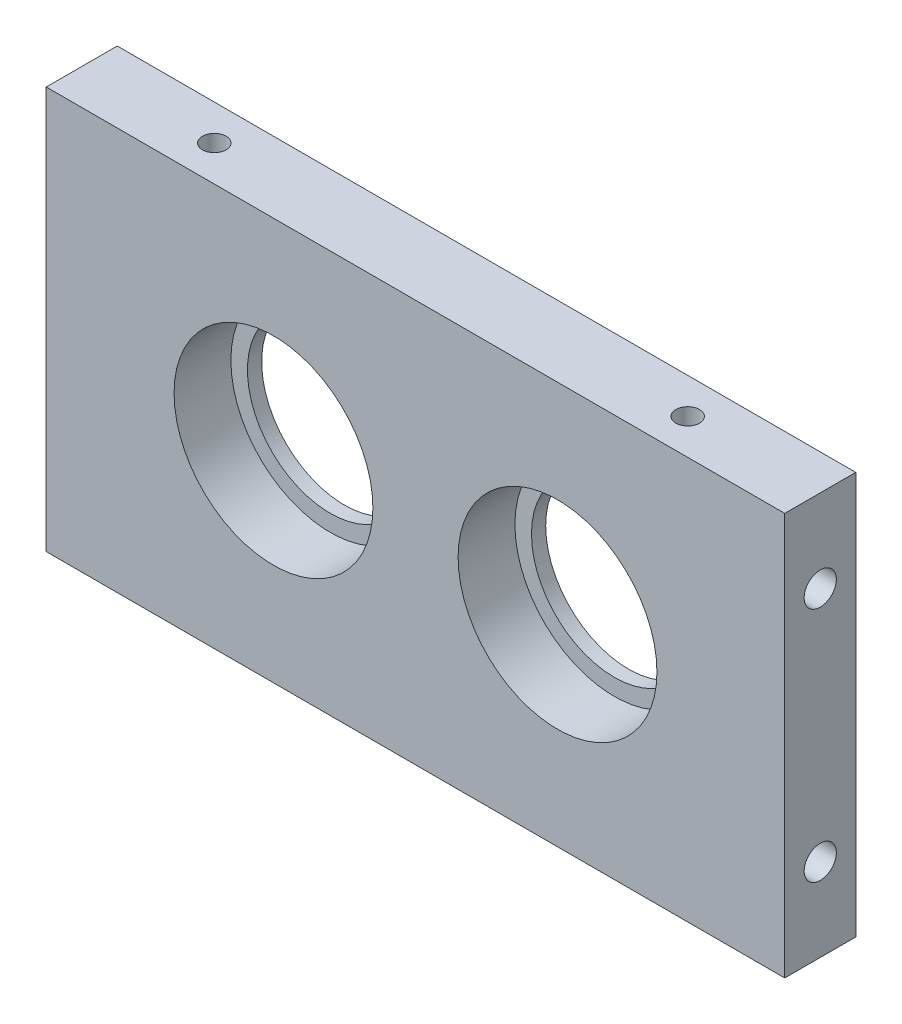
ISO-10303-21;
HEADER;
FILE_DESCRIPTION(('STEP AP214'),'2;1');
FILE_NAME('part.step','',(''),(''),'','','');
FILE_SCHEMA(('AUTOMOTIVE_DESIGN { 1 0 10303 214 1 1 1 1 }'));
ENDSEC;
DATA;
#1=APPLICATION_CONTEXT('core data for automotive mechanical design processes');
#2=APPLICATION_PROTOCOL_DEFINITION('international standard','automotive_design',2000,#1);
#3=PRODUCT_CONTEXT('',#1,'mechanical');
#4=PRODUCT('Part','Part','',(#3));
#5=PRODUCT_RELATED_PRODUCT_CATEGORY('part','',(#4));
#6=PRODUCT_DEFINITION_FORMATION('','',#4);
#7=PRODUCT_DEFINITION_CONTEXT('part definition',#1,'design');
#8=PRODUCT_DEFINITION('design','',#6,#7);
#9=PRODUCT_DEFINITION_SHAPE('','',#8);
#10=(LENGTH_UNIT() NAMED_UNIT(*) SI_UNIT(.MILLI.,.METRE.));
#11=(NAMED_UNIT(*) PLANE_ANGLE_UNIT() SI_UNIT($,.RADIAN.));
#12=(NAMED_UNIT(*) SI_UNIT($,.STERADIAN.) SOLID_ANGLE_UNIT());
#13=UNCERTAINTY_MEASURE_WITH_UNIT(LENGTH_MEASURE(1.E-05),#10,'distance_accuracy_value','');
#14=(GEOMETRIC_REPRESENTATION_CONTEXT(3) GLOBAL_UNCERTAINTY_ASSIGNED_CONTEXT((#13)) GLOBAL_UNIT_ASSIGNED_CONTEXT((#10,
#11,#12)) REPRESENTATION_CONTEXT('',''));
#15=CARTESIAN_POINT('',(0.,0.,0.));
#16=DIRECTION('',(0.,0.,1.));
#17=DIRECTION('',(1.,0.,0.));
#18=AXIS2_PLACEMENT_3D('',#15,#16,#17);
#19=CARTESIAN_POINT('',(30.,0.,7.5));
#20=DIRECTION('',(0.,0.,-1.));
#21=DIRECTION('',(-1.,0.,0.));
#22=AXIS2_PLACEMENT_3D('',#19,#20,#21);
#23=CYLINDRICAL_SURFACE('',#22,17.5);
#24=CARTESIAN_POINT('',(30.,0.,-7.5));
#25=DIRECTION('',(0.,0.,1.));
#26=DIRECTION('',(-1.,0.,0.));
#27=AXIS2_PLACEMENT_3D('',#24,#25,#26);
#28=CIRCLE('',#27,17.5);
#29=CARTESIAN_POINT('',(12.5,0.,-7.5));
#30=VERTEX_POINT('',#29);
#31=EDGE_CURVE('E183',#30,#30,#28,.T.);
#32=ORIENTED_EDGE('',*,*,#31,.F.);
#33=EDGE_LOOP('',(#32));
#34=FACE_BOUND('',#33,.T.);
#35=CARTESIAN_POINT('',(30.,0.,-4.5));
#36=DIRECTION('',(0.,0.,1.));
#37=DIRECTION('',(1.,0.,0.));
#38=AXIS2_PLACEMENT_3D('',#35,#36,#37);
#39=CIRCLE('',#38,17.5);
#40=CARTESIAN_POINT('',(47.5,0.,-4.5));
#41=VERTEX_POINT('',#40);
#42=EDGE_CURVE('E42',#41,#41,#39,.T.);
#43=ORIENTED_EDGE('',*,*,#42,.T.);
#44=EDGE_LOOP('',(#43));
#45=FACE_BOUND('',#44,.T.);
#46=ADVANCED_FACE('F38',(#34,#45),#23,.F.);
#47=CARTESIAN_POINT('',(-30.,0.,7.5));
#48=DIRECTION('',(0.,0.,-1.));
#49=DIRECTION('',(-1.,0.,0.));
#50=AXIS2_PLACEMENT_3D('',#47,#48,#49);
#51=CYLINDRICAL_SURFACE('',#50,17.5);
#52=CARTESIAN_POINT('',(-30.,0.,-7.5));
#53=DIRECTION('',(0.,0.,1.));
#54=DIRECTION('',(1.,0.,0.));
#55=AXIS2_PLACEMENT_3D('',#52,#53,#54);
#56=CIRCLE('',#55,17.5);
#57=CARTESIAN_POINT('',(-12.5,0.,-7.5));
#58=VERTEX_POINT('',#57);
#59=EDGE_CURVE('E186',#58,#58,#56,.T.);
#60=ORIENTED_EDGE('',*,*,#59,.F.);
#61=EDGE_LOOP('',(#60));
#62=FACE_BOUND('',#61,.T.);
#63=CARTESIAN_POINT('',(-30.,0.,-4.5));
#64=DIRECTION('',(0.,0.,1.));
#65=DIRECTION('',(1.,0.,0.));
#66=AXIS2_PLACEMENT_3D('',#63,#64,#65);
#67=CIRCLE('',#66,17.5);
#68=CARTESIAN_POINT('',(-12.5,0.,-4.5));
#69=VERTEX_POINT('',#68);
#70=EDGE_CURVE('E179',#69,#69,#67,.T.);
#71=ORIENTED_EDGE('',*,*,#70,.T.);
#72=EDGE_LOOP('',(#71));
#73=FACE_BOUND('',#72,.T.);
#74=ADVANCED_FACE('F209',(#62,#73),#51,.F.);
#75=CARTESIAN_POINT('',(78.,42.5,7.5));
#76=DIRECTION('',(0.,0.,-1.));
#77=DIRECTION('',(-1.,0.,0.));
#78=AXIS2_PLACEMENT_3D('',#75,#76,#77);
#79=PLANE('',#78);
#80=CARTESIAN_POINT('',(30.,0.,7.5));
#81=DIRECTION('',(0.,0.,1.));
#82=DIRECTION('',(1.,0.,0.));
#83=AXIS2_PLACEMENT_3D('',#80,#81,#82);
#84=CIRCLE('',#83,21.);
#85=CARTESIAN_POINT('',(51.,0.,7.5));
#86=VERTEX_POINT('',#85);
#87=EDGE_CURVE('E170',#86,#86,#84,.T.);
#88=ORIENTED_EDGE('',*,*,#87,.F.);
#89=EDGE_LOOP('',(#88));
#90=FACE_BOUND('',#89,.T.);
#91=CARTESIAN_POINT('',(-30.,0.,7.5));
#92=DIRECTION('',(0.,0.,1.));
#93=DIRECTION('',(1.,0.,0.));
#94=AXIS2_PLACEMENT_3D('',#91,#92,#93);
#95=CIRCLE('',#94,21.);
#96=CARTESIAN_POINT('',(-8.99999999999999,0.,7.5));
#97=VERTEX_POINT('',#96);
#98=EDGE_CURVE('E180',#97,#97,#95,.T.);
#99=ORIENTED_EDGE('',*,*,#98,.F.);
#100=EDGE_LOOP('',(#99));
#101=FACE_BOUND('',#100,.T.);
#102=DIRECTION('',(0.,1.,0.));
#103=VECTOR('',#102,1.);
#104=CARTESIAN_POINT('',(78.,-42.5,7.5));
#105=LINE('',#104,#103);
#106=CARTESIAN_POINT('',(78.,-42.5,7.5));
#107=VERTEX_POINT('',#106);
#108=CARTESIAN_POINT('',(78.,42.5,7.5));
#109=VERTEX_POINT('',#108);
#110=EDGE_CURVE('E190',#107,#109,#105,.T.);
#111=ORIENTED_EDGE('',*,*,#110,.T.);
#112=DIRECTION('',(-1.,0.,0.));
#113=VECTOR('',#112,1.);
#114=CARTESIAN_POINT('',(-78.,42.5,7.5));
#115=LINE('',#114,#113);
#116=CARTESIAN_POINT('',(-78.,42.5,7.5));
#117=VERTEX_POINT('',#116);
#118=EDGE_CURVE('E88',#109,#117,#115,.T.);
#119=ORIENTED_EDGE('',*,*,#118,.T.);
#120=DIRECTION('',(0.,-1.,0.));
#121=VECTOR('',#120,1.);
#122=CARTESIAN_POINT('',(-78.,-42.5,7.5));
#123=LINE('',#122,#121);
#124=CARTESIAN_POINT('',(-78.,-42.5,7.5));
#125=VERTEX_POINT('',#124);
#126=EDGE_CURVE('E193',#117,#125,#123,.T.);
#127=ORIENTED_EDGE('',*,*,#126,.T.);
#128=DIRECTION('',(1.,0.,0.));
#129=VECTOR('',#128,1.);
#130=CARTESIAN_POINT('',(-78.,-42.5,7.5));
#131=LINE('',#130,#129);
#132=EDGE_CURVE('E57',#125,#107,#131,.T.);
#133=ORIENTED_EDGE('',*,*,#132,.T.);
#134=EDGE_LOOP('',(#111,#119,#127,#133));
#135=FACE_BOUND('',#134,.T.);
#136=ADVANCED_FACE('F225',(#90,#101,#135),#79,.F.);
#137=CARTESIAN_POINT('',(78.,42.5,-7.5));
#138=DIRECTION('',(0.,0.,-1.));
#139=DIRECTION('',(-1.,0.,0.));
#140=AXIS2_PLACEMENT_3D('',#137,#138,#139);
#141=PLANE('',#140);
#142=ORIENTED_EDGE('',*,*,#59,.T.);
#143=EDGE_LOOP('',(#142));
#144=FACE_BOUND('',#143,.T.);
#145=DIRECTION('',(0.,1.,0.));
#146=VECTOR('',#145,1.);
#147=CARTESIAN_POINT('',(78.,-42.5,-7.5));
#148=LINE('',#147,#146);
#149=CARTESIAN_POINT('',(78.,-42.5,-7.5));
#150=VERTEX_POINT('',#149);
#151=CARTESIAN_POINT('',(78.,42.5,-7.5));
#152=VERTEX_POINT('',#151);
#153=EDGE_CURVE('E189',#150,#152,#148,.T.);
#154=ORIENTED_EDGE('',*,*,#153,.F.);
#155=DIRECTION('',(1.,0.,0.));
#156=VECTOR('',#155,1.);
#157=CARTESIAN_POINT('',(-78.,-42.5,-7.5));
#158=LINE('',#157,#156);
#159=CARTESIAN_POINT('',(-78.,-42.5,-7.5));
#160=VERTEX_POINT('',#159);
#161=EDGE_CURVE('E81',#160,#150,#158,.T.);
#162=ORIENTED_EDGE('',*,*,#161,.F.);
#163=DIRECTION('',(0.,-1.,0.));
#164=VECTOR('',#163,1.);
#165=CARTESIAN_POINT('',(-78.,-42.5,-7.5));
#166=LINE('',#165,#164);
#167=CARTESIAN_POINT('',(-78.,42.5,-7.5));
#168=VERTEX_POINT('',#167);
#169=EDGE_CURVE('E75',#168,#160,#166,.T.);
#170=ORIENTED_EDGE('',*,*,#169,.F.);
#171=DIRECTION('',(-1.,0.,0.));
#172=VECTOR('',#171,1.);
#173=CARTESIAN_POINT('',(-78.,42.5,-7.5));
#174=LINE('',#173,#172);
#175=EDGE_CURVE('E199',#152,#168,#174,.T.);
#176=ORIENTED_EDGE('',*,*,#175,.F.);
#177=EDGE_LOOP('',(#154,#162,#170,#176));
#178=FACE_BOUND('',#177,.T.);
#179=ORIENTED_EDGE('',*,*,#31,.T.);
#180=EDGE_LOOP('',(#179));
#181=FACE_BOUND('',#180,.T.);
#182=ADVANCED_FACE('F227',(#144,#178,#181),#141,.T.);
#183=CARTESIAN_POINT('',(78.,-42.5,7.5));
#184=DIRECTION('',(-1.,0.,0.));
#185=DIRECTION('',(0.,0.,1.));
#186=AXIS2_PLACEMENT_3D('',#183,#184,#185);
#187=PLANE('',#186);
#188=CARTESIAN_POINT('',(78.,25.,0.));
#189=DIRECTION('',(1.,0.,0.));
#190=DIRECTION('',(0.,0.,-1.));
#191=AXIS2_PLACEMENT_3D('',#188,#189,#190);
#192=CIRCLE('',#191,3.4);
#193=CARTESIAN_POINT('',(78.,25.,-3.4));
#194=VERTEX_POINT('',#193);
#195=EDGE_CURVE('E158',#194,#194,#192,.T.);
#196=ORIENTED_EDGE('',*,*,#195,.F.);
#197=EDGE_LOOP('',(#196));
#198=FACE_BOUND('',#197,.T.);
#199=CARTESIAN_POINT('',(78.,-25.,0.));
#200=DIRECTION('',(1.,0.,0.));
#201=DIRECTION('',(0.,0.,-1.));
#202=AXIS2_PLACEMENT_3D('',#199,#200,#201);
#203=CIRCLE('',#202,3.4);
#204=CARTESIAN_POINT('',(78.,-25.,-3.4));
#205=VERTEX_POINT('',#204);
#206=EDGE_CURVE('E164',#205,#205,#203,.T.);
#207=ORIENTED_EDGE('',*,*,#206,.F.);
#208=EDGE_LOOP('',(#207));
#209=FACE_BOUND('',#208,.T.);
#210=ORIENTED_EDGE('',*,*,#153,.T.);
#211=DIRECTION('',(0.,0.,-1.));
#212=VECTOR('',#211,1.);
#213=CARTESIAN_POINT('',(78.,42.5,7.5));
#214=LINE('',#213,#212);
#215=EDGE_CURVE('E11',#109,#152,#214,.T.);
#216=ORIENTED_EDGE('',*,*,#215,.F.);
#217=ORIENTED_EDGE('',*,*,#110,.F.);
#218=DIRECTION('',(0.,0.,-1.));
#219=VECTOR('',#218,1.);
#220=CARTESIAN_POINT('',(78.,-42.5,7.5));
#221=LINE('',#220,#219);
#222=EDGE_CURVE('E196',#107,#150,#221,.T.);
#223=ORIENTED_EDGE('',*,*,#222,.T.);
#224=EDGE_LOOP('',(#210,#216,#217,#223));
#225=FACE_BOUND('',#224,.T.);
#226=ADVANCED_FACE('F40',(#198,#209,#225),#187,.F.);
#227=CARTESIAN_POINT('',(-78.,42.5,7.5));
#228=DIRECTION('',(0.,-1.,0.));
#229=DIRECTION('',(0.,0.,-1.));
#230=AXIS2_PLACEMENT_3D('',#227,#228,#229);
#231=PLANE('',#230);
#232=CARTESIAN_POINT('',(-50.,42.5,0.));
#233=DIRECTION('',(0.,1.,0.));
#234=DIRECTION('',(0.,0.,1.));
#235=AXIS2_PLACEMENT_3D('',#232,#233,#234);
#236=CIRCLE('',#235,2.5);
#237=CARTESIAN_POINT('',(-50.,42.5,2.5));
#238=VERTEX_POINT('',#237);
#239=EDGE_CURVE('E134',#238,#238,#236,.T.);
#240=ORIENTED_EDGE('',*,*,#239,.F.);
#241=EDGE_LOOP('',(#240));
#242=FACE_BOUND('',#241,.T.);
#243=CARTESIAN_POINT('',(50.,42.5,0.));
#244=DIRECTION('',(0.,1.,0.));
#245=DIRECTION('',(0.,0.,1.));
#246=AXIS2_PLACEMENT_3D('',#243,#244,#245);
#247=CIRCLE('',#246,2.5);
#248=CARTESIAN_POINT('',(50.,42.5,2.5));
#249=VERTEX_POINT('',#248);
#250=EDGE_CURVE('E140',#249,#249,#247,.T.);
#251=ORIENTED_EDGE('',*,*,#250,.F.);
#252=EDGE_LOOP('',(#251));
#253=FACE_BOUND('',#252,.T.);
#254=ORIENTED_EDGE('',*,*,#175,.T.);
#255=DIRECTION('',(0.,0.,-1.));
#256=VECTOR('',#255,1.);
#257=CARTESIAN_POINT('',(-78.,42.5,7.5));
#258=LINE('',#257,#256);
#259=EDGE_CURVE('E48',#117,#168,#258,.T.);
#260=ORIENTED_EDGE('',*,*,#259,.F.);
#261=ORIENTED_EDGE('',*,*,#118,.F.);
#262=ORIENTED_EDGE('',*,*,#215,.T.);
#263=EDGE_LOOP('',(#254,#260,#261,#262));
#264=FACE_BOUND('',#263,.T.);
#265=ADVANCED_FACE('F234',(#242,#253,#264),#231,.F.);
#266=CARTESIAN_POINT('',(-78.,-42.5,7.5));
#267=DIRECTION('',(1.,0.,0.));
#268=DIRECTION('',(0.,0.,-1.));
#269=AXIS2_PLACEMENT_3D('',#266,#267,#268);
#270=PLANE('',#269);
#271=CARTESIAN_POINT('',(-78.,25.,0.));
#272=DIRECTION('',(-1.,0.,0.));
#273=DIRECTION('',(0.,0.,1.));
#274=AXIS2_PLACEMENT_3D('',#271,#272,#273);
#275=CIRCLE('',#274,3.4);
#276=CARTESIAN_POINT('',(-78.,25.,3.4));
#277=VERTEX_POINT('',#276);
#278=EDGE_CURVE('E146',#277,#277,#275,.T.);
#279=ORIENTED_EDGE('',*,*,#278,.F.);
#280=EDGE_LOOP('',(#279));
#281=FACE_BOUND('',#280,.T.);
#282=CARTESIAN_POINT('',(-78.,-25.,0.));
#283=DIRECTION('',(-1.,0.,0.));
#284=DIRECTION('',(0.,0.,1.));
#285=AXIS2_PLACEMENT_3D('',#282,#283,#284);
#286=CIRCLE('',#285,3.4);
#287=CARTESIAN_POINT('',(-78.,-25.,3.4));
#288=VERTEX_POINT('',#287);
#289=EDGE_CURVE('E152',#288,#288,#286,.T.);
#290=ORIENTED_EDGE('',*,*,#289,.F.);
#291=EDGE_LOOP('',(#290));
#292=FACE_BOUND('',#291,.T.);
#293=ORIENTED_EDGE('',*,*,#169,.T.);
#294=DIRECTION('',(0.,0.,-1.));
#295=VECTOR('',#294,1.);
#296=CARTESIAN_POINT('',(-78.,-42.5,7.5));
#297=LINE('',#296,#295);
#298=EDGE_CURVE('E204',#125,#160,#297,.T.);
#299=ORIENTED_EDGE('',*,*,#298,.F.);
#300=ORIENTED_EDGE('',*,*,#126,.F.);
#301=ORIENTED_EDGE('',*,*,#259,.T.);
#302=EDGE_LOOP('',(#293,#299,#300,#301));
#303=FACE_BOUND('',#302,.T.);
#304=ADVANCED_FACE('F237',(#281,#292,#303),#270,.F.);
#305=CARTESIAN_POINT('',(-78.,-42.5,7.5));
#306=DIRECTION('',(0.,1.,0.));
#307=DIRECTION('',(0.,0.,1.));
#308=AXIS2_PLACEMENT_3D('',#305,#306,#307);
#309=PLANE('',#308);
#310=CARTESIAN_POINT('',(-50.,-42.5,0.));
#311=DIRECTION('',(0.,-1.,0.));
#312=DIRECTION('',(0.,0.,-1.));
#313=AXIS2_PLACEMENT_3D('',#310,#311,#312);
#314=CIRCLE('',#313,2.5);
#315=CARTESIAN_POINT('',(-50.,-42.5,-2.5));
#316=VERTEX_POINT('',#315);
#317=EDGE_CURVE('E124',#316,#316,#314,.T.);
#318=ORIENTED_EDGE('',*,*,#317,.F.);
#319=EDGE_LOOP('',(#318));
#320=FACE_BOUND('',#319,.T.);
#321=CARTESIAN_POINT('',(50.,-42.5,0.));
#322=DIRECTION('',(0.,-1.,0.));
#323=DIRECTION('',(0.,0.,-1.));
#324=AXIS2_PLACEMENT_3D('',#321,#322,#323);
#325=CIRCLE('',#324,2.5);
#326=CARTESIAN_POINT('',(50.,-42.5,-2.5));
#327=VERTEX_POINT('',#326);
#328=EDGE_CURVE('E123',#327,#327,#325,.T.);
#329=ORIENTED_EDGE('',*,*,#328,.F.);
#330=EDGE_LOOP('',(#329));
#331=FACE_BOUND('',#330,.T.);
#332=ORIENTED_EDGE('',*,*,#161,.T.);
#333=ORIENTED_EDGE('',*,*,#222,.F.);
#334=ORIENTED_EDGE('',*,*,#132,.F.);
#335=ORIENTED_EDGE('',*,*,#298,.T.);
#336=EDGE_LOOP('',(#332,#333,#334,#335));
#337=FACE_BOUND('',#336,.T.);
#338=ADVANCED_FACE('F221',(#320,#331,#337),#309,.F.);
#339=CARTESIAN_POINT('',(-30.,0.,-4.5));
#340=DIRECTION('',(0.,0.,1.));
#341=DIRECTION('',(1.,0.,0.));
#342=AXIS2_PLACEMENT_3D('',#339,#340,#341);
#343=CYLINDRICAL_SURFACE('',#342,21.);
#344=CARTESIAN_POINT('',(-30.,0.,-4.5));
#345=DIRECTION('',(0.,0.,1.));
#346=DIRECTION('',(1.,0.,0.));
#347=AXIS2_PLACEMENT_3D('',#344,#345,#346);
#348=CIRCLE('',#347,21.);
#349=CARTESIAN_POINT('',(-8.99999999999999,0.,-4.5));
#350=VERTEX_POINT('',#349);
#351=EDGE_CURVE('E176',#350,#350,#348,.T.);
#352=ORIENTED_EDGE('',*,*,#351,.F.);
#353=EDGE_LOOP('',(#352));
#354=FACE_BOUND('',#353,.T.);
#355=ORIENTED_EDGE('',*,*,#98,.T.);
#356=EDGE_LOOP('',(#355));
#357=FACE_BOUND('',#356,.T.);
#358=ADVANCED_FACE('F215',(#354,#357),#343,.F.);
#359=CARTESIAN_POINT('',(-30.,0.,-4.5));
#360=DIRECTION('',(0.,0.,1.));
#361=DIRECTION('',(1.,0.,0.));
#362=AXIS2_PLACEMENT_3D('',#359,#360,#361);
#363=PLANE('',#362);
#364=ORIENTED_EDGE('',*,*,#70,.F.);
#365=EDGE_LOOP('',(#364));
#366=FACE_BOUND('',#365,.T.);
#367=ORIENTED_EDGE('',*,*,#351,.T.);
#368=EDGE_LOOP('',(#367));
#369=FACE_BOUND('',#368,.T.);
#370=ADVANCED_FACE('F211',(#366,#369),#363,.T.);
#371=CARTESIAN_POINT('',(30.,0.,-4.5));
#372=DIRECTION('',(0.,0.,1.));
#373=DIRECTION('',(1.,0.,0.));
#374=AXIS2_PLACEMENT_3D('',#371,#372,#373);
#375=CYLINDRICAL_SURFACE('',#374,21.);
#376=CARTESIAN_POINT('',(30.,0.,-4.5));
#377=DIRECTION('',(0.,0.,1.));
#378=DIRECTION('',(1.,0.,0.));
#379=AXIS2_PLACEMENT_3D('',#376,#377,#378);
#380=CIRCLE('',#379,21.);
#381=CARTESIAN_POINT('',(51.,0.,-4.5));
#382=VERTEX_POINT('',#381);
#383=EDGE_CURVE('E171',#382,#382,#380,.T.);
#384=ORIENTED_EDGE('',*,*,#383,.F.);
#385=EDGE_LOOP('',(#384));
#386=FACE_BOUND('',#385,.T.);
#387=ORIENTED_EDGE('',*,*,#87,.T.);
#388=EDGE_LOOP('',(#387));
#389=FACE_BOUND('',#388,.T.);
#390=ADVANCED_FACE('F214',(#386,#389),#375,.F.);
#391=CARTESIAN_POINT('',(30.,0.,-4.5));
#392=DIRECTION('',(0.,0.,1.));
#393=DIRECTION('',(1.,0.,0.));
#394=AXIS2_PLACEMENT_3D('',#391,#392,#393);
#395=PLANE('',#394);
#396=ORIENTED_EDGE('',*,*,#42,.F.);
#397=EDGE_LOOP('',(#396));
#398=FACE_BOUND('',#397,.T.);
#399=ORIENTED_EDGE('',*,*,#383,.T.);
#400=EDGE_LOOP('',(#399));
#401=FACE_BOUND('',#400,.T.);
#402=ADVANCED_FACE('F250',(#398,#401),#395,.T.);
#403=CARTESIAN_POINT('',(58.25,-25.,0.));
#404=DIRECTION('',(1.,0.,0.));
#405=DIRECTION('',(0.,0.,-1.));
#406=AXIS2_PLACEMENT_3D('',#403,#404,#405);
#407=CONICAL_SURFACE('',#406,3.4,1.02974425867665);
#408=CARTESIAN_POINT('',(56.2070738953063,-25.,0.));
#409=VERTEX_POINT('',#408);
#410=VERTEX_LOOP('',#409);
#411=FACE_BOUND('',#410,.T.);
#412=CARTESIAN_POINT('',(58.25,-25.,0.));
#413=DIRECTION('',(1.,0.,0.));
#414=DIRECTION('',(0.,0.,-1.));
#415=AXIS2_PLACEMENT_3D('',#412,#413,#414);
#416=CIRCLE('',#415,3.4);
#417=CARTESIAN_POINT('',(58.25,-25.,-3.4));
#418=VERTEX_POINT('',#417);
#419=EDGE_CURVE('E167',#418,#418,#416,.T.);
#420=ORIENTED_EDGE('',*,*,#419,.T.);
#421=EDGE_LOOP('',(#420));
#422=FACE_BOUND('',#421,.T.);
#423=ADVANCED_FACE('F253',(#411,#422),#407,.F.);
#424=CARTESIAN_POINT('',(78.,-25.,0.));
#425=DIRECTION('',(1.,0.,0.));
#426=DIRECTION('',(0.,0.,-1.));
#427=AXIS2_PLACEMENT_3D('',#424,#425,#426);
#428=CYLINDRICAL_SURFACE('',#427,3.4);
#429=ORIENTED_EDGE('',*,*,#419,.F.);
#430=EDGE_LOOP('',(#429));
#431=FACE_BOUND('',#430,.T.);
#432=ORIENTED_EDGE('',*,*,#206,.T.);
#433=EDGE_LOOP('',(#432));
#434=FACE_BOUND('',#433,.T.);
#435=ADVANCED_FACE('F324',(#431,#434),#428,.F.);
#436=CARTESIAN_POINT('',(58.25,25.,0.));
#437=DIRECTION('',(1.,0.,0.));
#438=DIRECTION('',(0.,0.,-1.));
#439=AXIS2_PLACEMENT_3D('',#436,#437,#438);
#440=CONICAL_SURFACE('',#439,3.4,1.02974425867665);
#441=CARTESIAN_POINT('',(56.2070738953063,25.,0.));
#442=VERTEX_POINT('',#441);
#443=VERTEX_LOOP('',#442);
#444=FACE_BOUND('',#443,.T.);
#445=CARTESIAN_POINT('',(58.25,25.,0.));
#446=DIRECTION('',(1.,0.,0.));
#447=DIRECTION('',(0.,0.,-1.));
#448=AXIS2_PLACEMENT_3D('',#445,#446,#447);
#449=CIRCLE('',#448,3.4);
#450=CARTESIAN_POINT('',(58.25,25.,-3.4));
#451=VERTEX_POINT('',#450);
#452=EDGE_CURVE('E161',#451,#451,#449,.T.);
#453=ORIENTED_EDGE('',*,*,#452,.T.);
#454=EDGE_LOOP('',(#453));
#455=FACE_BOUND('',#454,.T.);
#456=ADVANCED_FACE('F320',(#444,#455),#440,.F.);
#457=CARTESIAN_POINT('',(78.,25.,0.));
#458=DIRECTION('',(1.,0.,0.));
#459=DIRECTION('',(0.,0.,-1.));
#460=AXIS2_PLACEMENT_3D('',#457,#458,#459);
#461=CYLINDRICAL_SURFACE('',#460,3.4);
#462=ORIENTED_EDGE('',*,*,#452,.F.);
#463=EDGE_LOOP('',(#462));
#464=FACE_BOUND('',#463,.T.);
#465=ORIENTED_EDGE('',*,*,#195,.T.);
#466=EDGE_LOOP('',(#465));
#467=FACE_BOUND('',#466,.T.);
#468=ADVANCED_FACE('F316',(#464,#467),#461,.F.);
#469=CARTESIAN_POINT('',(-58.25,-25.,0.));
#470=DIRECTION('',(-1.,0.,0.));
#471=DIRECTION('',(0.,0.,1.));
#472=AXIS2_PLACEMENT_3D('',#469,#470,#471);
#473=CONICAL_SURFACE('',#472,3.4,1.02974425867665);
#474=CARTESIAN_POINT('',(-56.2070738953063,-25.,0.));
#475=VERTEX_POINT('',#474);
#476=VERTEX_LOOP('',#475);
#477=FACE_BOUND('',#476,.T.);
#478=CARTESIAN_POINT('',(-58.25,-25.,0.));
#479=DIRECTION('',(-1.,0.,0.));
#480=DIRECTION('',(0.,0.,1.));
#481=AXIS2_PLACEMENT_3D('',#478,#479,#480);
#482=CIRCLE('',#481,3.4);
#483=CARTESIAN_POINT('',(-58.25,-25.,3.4));
#484=VERTEX_POINT('',#483);
#485=EDGE_CURVE('E155',#484,#484,#482,.T.);
#486=ORIENTED_EDGE('',*,*,#485,.T.);
#487=EDGE_LOOP('',(#486));
#488=FACE_BOUND('',#487,.T.);
#489=ADVANCED_FACE('F312',(#477,#488),#473,.F.);
#490=CARTESIAN_POINT('',(-78.,-25.,0.));
#491=DIRECTION('',(-1.,0.,0.));
#492=DIRECTION('',(0.,0.,1.));
#493=AXIS2_PLACEMENT_3D('',#490,#491,#492);
#494=CYLINDRICAL_SURFACE('',#493,3.4);
#495=ORIENTED_EDGE('',*,*,#485,.F.);
#496=EDGE_LOOP('',(#495));
#497=FACE_BOUND('',#496,.T.);
#498=ORIENTED_EDGE('',*,*,#289,.T.);
#499=EDGE_LOOP('',(#498));
#500=FACE_BOUND('',#499,.T.);
#501=ADVANCED_FACE('F308',(#497,#500),#494,.F.);
#502=CARTESIAN_POINT('',(-58.25,25.,0.));
#503=DIRECTION('',(-1.,0.,0.));
#504=DIRECTION('',(0.,0.,1.));
#505=AXIS2_PLACEMENT_3D('',#502,#503,#504);
#506=CONICAL_SURFACE('',#505,3.4,1.02974425867665);
#507=CARTESIAN_POINT('',(-56.2070738953063,25.,0.));
#508=VERTEX_POINT('',#507);
#509=VERTEX_LOOP('',#508);
#510=FACE_BOUND('',#509,.T.);
#511=CARTESIAN_POINT('',(-58.25,25.,0.));
#512=DIRECTION('',(-1.,0.,0.));
#513=DIRECTION('',(0.,0.,1.));
#514=AXIS2_PLACEMENT_3D('',#511,#512,#513);
#515=CIRCLE('',#514,3.4);
#516=CARTESIAN_POINT('',(-58.25,25.,3.4));
#517=VERTEX_POINT('',#516);
#518=EDGE_CURVE('E149',#517,#517,#515,.T.);
#519=ORIENTED_EDGE('',*,*,#518,.T.);
#520=EDGE_LOOP('',(#519));
#521=FACE_BOUND('',#520,.T.);
#522=ADVANCED_FACE('F304',(#510,#521),#506,.F.);
#523=CARTESIAN_POINT('',(-78.,25.,0.));
#524=DIRECTION('',(-1.,0.,0.));
#525=DIRECTION('',(0.,0.,1.));
#526=AXIS2_PLACEMENT_3D('',#523,#524,#525);
#527=CYLINDRICAL_SURFACE('',#526,3.4);
#528=ORIENTED_EDGE('',*,*,#518,.F.);
#529=EDGE_LOOP('',(#528));
#530=FACE_BOUND('',#529,.T.);
#531=ORIENTED_EDGE('',*,*,#278,.T.);
#532=EDGE_LOOP('',(#531));
#533=FACE_BOUND('',#532,.T.);
#534=ADVANCED_FACE('F296',(#530,#533),#527,.F.);
#535=CARTESIAN_POINT('',(50.,27.5,0.));
#536=DIRECTION('',(0.,1.,0.));
#537=DIRECTION('',(0.,0.,1.));
#538=AXIS2_PLACEMENT_3D('',#535,#536,#537);
#539=CONICAL_SURFACE('',#538,2.5,1.02974425867665);
#540=CARTESIAN_POINT('',(50.,25.9978484524311,0.));
#541=VERTEX_POINT('',#540);
#542=VERTEX_LOOP('',#541);
#543=FACE_BOUND('',#542,.T.);
#544=CARTESIAN_POINT('',(50.,27.5,0.));
#545=DIRECTION('',(0.,1.,0.));
#546=DIRECTION('',(0.,0.,1.));
#547=AXIS2_PLACEMENT_3D('',#544,#545,#546);
#548=CIRCLE('',#547,2.5);
#549=CARTESIAN_POINT('',(50.,27.5,2.5));
#550=VERTEX_POINT('',#549);
#551=EDGE_CURVE('E143',#550,#550,#548,.T.);
#552=ORIENTED_EDGE('',*,*,#551,.T.);
#553=EDGE_LOOP('',(#552));
#554=FACE_BOUND('',#553,.T.);
#555=ADVANCED_FACE('F286',(#543,#554),#539,.F.);
#556=CARTESIAN_POINT('',(50.,42.5,0.));
#557=DIRECTION('',(0.,1.,0.));
#558=DIRECTION('',(0.,0.,1.));
#559=AXIS2_PLACEMENT_3D('',#556,#557,#558);
#560=CYLINDRICAL_SURFACE('',#559,2.5);
#561=ORIENTED_EDGE('',*,*,#551,.F.);
#562=EDGE_LOOP('',(#561));
#563=FACE_BOUND('',#562,.T.);
#564=ORIENTED_EDGE('',*,*,#250,.T.);
#565=EDGE_LOOP('',(#564));
#566=FACE_BOUND('',#565,.T.);
#567=ADVANCED_FACE('F283',(#563,#566),#560,.F.);
#568=CARTESIAN_POINT('',(-50.,27.5,0.));
#569=DIRECTION('',(0.,1.,0.));
#570=DIRECTION('',(0.,0.,1.));
#571=AXIS2_PLACEMENT_3D('',#568,#569,#570);
#572=CONICAL_SURFACE('',#571,2.5,1.02974425867665);
#573=CARTESIAN_POINT('',(-50.,25.9978484524311,0.));
#574=VERTEX_POINT('',#573);
#575=VERTEX_LOOP('',#574);
#576=FACE_BOUND('',#575,.T.);
#577=CARTESIAN_POINT('',(-50.,27.5,0.));
#578=DIRECTION('',(0.,1.,0.));
#579=DIRECTION('',(0.,0.,1.));
#580=AXIS2_PLACEMENT_3D('',#577,#578,#579);
#581=CIRCLE('',#580,2.5);
#582=CARTESIAN_POINT('',(-50.,27.5,2.5));
#583=VERTEX_POINT('',#582);
#584=EDGE_CURVE('E137',#583,#583,#581,.T.);
#585=ORIENTED_EDGE('',*,*,#584,.T.);
#586=EDGE_LOOP('',(#585));
#587=FACE_BOUND('',#586,.T.);
#588=ADVANCED_FACE('F285',(#576,#587),#572,.F.);
#589=CARTESIAN_POINT('',(-50.,42.5,0.));
#590=DIRECTION('',(0.,1.,0.));
#591=DIRECTION('',(0.,0.,1.));
#592=AXIS2_PLACEMENT_3D('',#589,#590,#591);
#593=CYLINDRICAL_SURFACE('',#592,2.5);
#594=ORIENTED_EDGE('',*,*,#584,.F.);
#595=EDGE_LOOP('',(#594));
#596=FACE_BOUND('',#595,.T.);
#597=ORIENTED_EDGE('',*,*,#239,.T.);
#598=EDGE_LOOP('',(#597));
#599=FACE_BOUND('',#598,.T.);
#600=ADVANCED_FACE('F293',(#596,#599),#593,.F.);
#601=CARTESIAN_POINT('',(50.,-27.5,0.));
#602=DIRECTION('',(0.,-1.,0.));
#603=DIRECTION('',(0.,0.,-1.));
#604=AXIS2_PLACEMENT_3D('',#601,#602,#603);
#605=CONICAL_SURFACE('',#604,2.5,1.02974425867665);
#606=CARTESIAN_POINT('',(50.,-25.9978484524311,0.));
#607=VERTEX_POINT('',#606);
#608=VERTEX_LOOP('',#607);
#609=FACE_BOUND('',#608,.T.);
#610=CARTESIAN_POINT('',(50.,-27.5,0.));
#611=DIRECTION('',(0.,-1.,0.));
#612=DIRECTION('',(0.,0.,-1.));
#613=AXIS2_PLACEMENT_3D('',#610,#611,#612);
#614=CIRCLE('',#613,2.5);
#615=CARTESIAN_POINT('',(50.,-27.5,-2.5));
#616=VERTEX_POINT('',#615);
#617=EDGE_CURVE('E127',#616,#616,#614,.T.);
#618=ORIENTED_EDGE('',*,*,#617,.T.);
#619=EDGE_LOOP('',(#618));
#620=FACE_BOUND('',#619,.T.);
#621=ADVANCED_FACE('F405',(#609,#620),#605,.F.);
#622=CARTESIAN_POINT('',(50.,-42.5,0.));
#623=DIRECTION('',(0.,-1.,0.));
#624=DIRECTION('',(0.,0.,-1.));
#625=AXIS2_PLACEMENT_3D('',#622,#623,#624);
#626=CYLINDRICAL_SURFACE('',#625,2.5);
#627=ORIENTED_EDGE('',*,*,#617,.F.);
#628=EDGE_LOOP('',(#627));
#629=FACE_BOUND('',#628,.T.);
#630=ORIENTED_EDGE('',*,*,#328,.T.);
#631=EDGE_LOOP('',(#630));
#632=FACE_BOUND('',#631,.T.);
#633=ADVANCED_FACE('F117',(#629,#632),#626,.F.);
#634=CARTESIAN_POINT('',(-50.,-27.5,0.));
#635=DIRECTION('',(0.,-1.,0.));
#636=DIRECTION('',(0.,0.,-1.));
#637=AXIS2_PLACEMENT_3D('',#634,#635,#636);
#638=CONICAL_SURFACE('',#637,2.5,1.02974425867665);
#639=CARTESIAN_POINT('',(-50.,-25.9978484524311,0.));
#640=VERTEX_POINT('',#639);
#641=VERTEX_LOOP('',#640);
#642=FACE_BOUND('',#641,.T.);
#643=CARTESIAN_POINT('',(-50.,-27.5,0.));
#644=DIRECTION('',(0.,-1.,0.));
#645=DIRECTION('',(0.,0.,-1.));
#646=AXIS2_PLACEMENT_3D('',#643,#644,#645);
#647=CIRCLE('',#646,2.5);
#648=CARTESIAN_POINT('',(-50.,-27.5,-2.5));
#649=VERTEX_POINT('',#648);
#650=EDGE_CURVE('E121',#649,#649,#647,.T.);
#651=ORIENTED_EDGE('',*,*,#650,.T.);
#652=EDGE_LOOP('',(#651));
#653=FACE_BOUND('',#652,.T.);
#654=ADVANCED_FACE('F113',(#642,#653),#638,.F.);
#655=CARTESIAN_POINT('',(-50.,-42.5,0.));
#656=DIRECTION('',(0.,-1.,0.));
#657=DIRECTION('',(0.,0.,-1.));
#658=AXIS2_PLACEMENT_3D('',#655,#656,#657);
#659=CYLINDRICAL_SURFACE('',#658,2.5);
#660=ORIENTED_EDGE('',*,*,#650,.F.);
#661=EDGE_LOOP('',(#660));
#662=FACE_BOUND('',#661,.T.);
#663=ORIENTED_EDGE('',*,*,#317,.T.);
#664=EDGE_LOOP('',(#663));
#665=FACE_BOUND('',#664,.T.);
#666=ADVANCED_FACE('F116',(#662,#665),#659,.F.);
#667=CLOSED_SHELL('',(#46,#74,#136,#182,#226,#265,#304,#338,#358,#370,#390,#402,#423,#435,#456,
#468,#489,#501,#522,#534,#555,#567,#588,#600,#621,#633,#654,#666));
#668=MANIFOLD_SOLID_BREP('B2',#667);
#669=ADVANCED_BREP_SHAPE_REPRESENTATION('',(#18,#668),#14);
#670=SHAPE_DEFINITION_REPRESENTATION(#9,#669);
ENDSEC;
END-ISO-10303-21;
